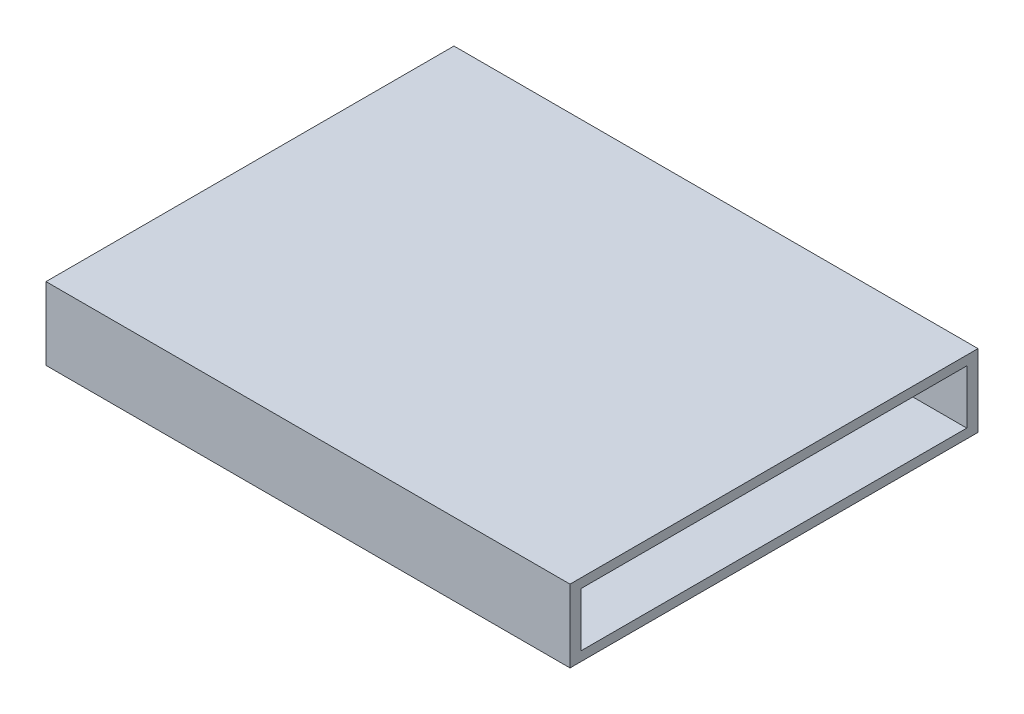
ISO-10303-21;
HEADER;
FILE_DESCRIPTION(('STEP AP214'),'2;1');
FILE_NAME('part.step','',(''),(''),'','','');
FILE_SCHEMA(('AUTOMOTIVE_DESIGN { 1 0 10303 214 1 1 1 1 }'));
ENDSEC;
DATA;
#1=APPLICATION_CONTEXT('core data for automotive mechanical design processes');
#2=APPLICATION_PROTOCOL_DEFINITION('international standard','automotive_design',2000,#1);
#3=PRODUCT_CONTEXT('',#1,'mechanical');
#4=PRODUCT('Part','Part','',(#3));
#5=PRODUCT_RELATED_PRODUCT_CATEGORY('part','',(#4));
#6=PRODUCT_DEFINITION_FORMATION('','',#4);
#7=PRODUCT_DEFINITION_CONTEXT('part definition',#1,'design');
#8=PRODUCT_DEFINITION('design','',#6,#7);
#9=PRODUCT_DEFINITION_SHAPE('','',#8);
#10=(LENGTH_UNIT() NAMED_UNIT(*) SI_UNIT(.MILLI.,.METRE.));
#11=(NAMED_UNIT(*) PLANE_ANGLE_UNIT() SI_UNIT($,.RADIAN.));
#12=(NAMED_UNIT(*) SI_UNIT($,.STERADIAN.) SOLID_ANGLE_UNIT());
#13=UNCERTAINTY_MEASURE_WITH_UNIT(LENGTH_MEASURE(1.E-05),#10,'distance_accuracy_value','');
#14=(GEOMETRIC_REPRESENTATION_CONTEXT(3) GLOBAL_UNCERTAINTY_ASSIGNED_CONTEXT((#13)) GLOBAL_UNIT_ASSIGNED_CONTEXT((#10,
#11,#12)) REPRESENTATION_CONTEXT('',''));
#15=CARTESIAN_POINT('',(0.,0.,0.));
#16=DIRECTION('',(0.,0.,1.));
#17=DIRECTION('',(1.,0.,0.));
#18=AXIS2_PLACEMENT_3D('',#15,#16,#17);
#19=CARTESIAN_POINT('',(0.,2.4638,0.));
#20=DIRECTION('',(1.,0.,0.));
#21=DIRECTION('',(0.,0.,-1.));
#22=AXIS2_PLACEMENT_3D('',#19,#20,#21);
#23=PLANE('',#22);
#24=DIRECTION('',(0.,0.,1.));
#25=VECTOR('',#24,1.);
#26=CARTESIAN_POINT('',(0.,0.,0.));
#27=LINE('',#26,#25);
#28=CARTESIAN_POINT('',(0.,0.,-13.843));
#29=VERTEX_POINT('',#28);
#30=CARTESIAN_POINT('',(0.,0.,0.));
#31=VERTEX_POINT('',#30);
#32=EDGE_CURVE('E163',#29,#31,#27,.T.);
#33=ORIENTED_EDGE('',*,*,#32,.T.);
#34=DIRECTION('',(0.,-1.,0.));
#35=VECTOR('',#34,1.);
#36=CARTESIAN_POINT('',(0.,2.4638,0.));
#37=LINE('',#36,#35);
#38=CARTESIAN_POINT('',(0.,2.4638,0.));
#39=VERTEX_POINT('',#38);
#40=EDGE_CURVE('E11',#39,#31,#37,.T.);
#41=ORIENTED_EDGE('',*,*,#40,.F.);
#42=DIRECTION('',(0.,0.,1.));
#43=VECTOR('',#42,1.);
#44=CARTESIAN_POINT('',(0.,2.4638,0.));
#45=LINE('',#44,#43);
#46=CARTESIAN_POINT('',(0.,2.4638,-13.843));
#47=VERTEX_POINT('',#46);
#48=EDGE_CURVE('E168',#47,#39,#45,.T.);
#49=ORIENTED_EDGE('',*,*,#48,.F.);
#50=DIRECTION('',(0.,-1.,0.));
#51=VECTOR('',#50,1.);
#52=CARTESIAN_POINT('',(0.,2.4638,-13.843));
#53=LINE('',#52,#51);
#54=EDGE_CURVE('E177',#47,#29,#53,.T.);
#55=ORIENTED_EDGE('',*,*,#54,.T.);
#56=EDGE_LOOP('',(#33,#41,#49,#55));
#57=FACE_BOUND('',#56,.T.);
#58=ADVANCED_FACE('F44',(#57),#23,.F.);
#59=CARTESIAN_POINT('',(0.,2.4638,0.));
#60=DIRECTION('',(0.,0.,-1.));
#61=DIRECTION('',(-1.,0.,0.));
#62=AXIS2_PLACEMENT_3D('',#59,#60,#61);
#63=PLANE('',#62);
#64=DIRECTION('',(1.,0.,0.));
#65=VECTOR('',#64,1.);
#66=CARTESIAN_POINT('',(0.,0.,0.));
#67=LINE('',#66,#65);
#68=CARTESIAN_POINT('',(17.78,0.,0.));
#69=VERTEX_POINT('',#68);
#70=EDGE_CURVE('E184',#31,#69,#67,.T.);
#71=ORIENTED_EDGE('',*,*,#70,.T.);
#72=DIRECTION('',(0.,-1.,0.));
#73=VECTOR('',#72,1.);
#74=CARTESIAN_POINT('',(17.78,2.4638,0.));
#75=LINE('',#74,#73);
#76=CARTESIAN_POINT('',(17.78,2.4638,0.));
#77=VERTEX_POINT('',#76);
#78=EDGE_CURVE('E52',#77,#69,#75,.T.);
#79=ORIENTED_EDGE('',*,*,#78,.F.);
#80=DIRECTION('',(1.,0.,0.));
#81=VECTOR('',#80,1.);
#82=CARTESIAN_POINT('',(0.,2.4638,0.));
#83=LINE('',#82,#81);
#84=EDGE_CURVE('E100',#39,#77,#83,.T.);
#85=ORIENTED_EDGE('',*,*,#84,.F.);
#86=ORIENTED_EDGE('',*,*,#40,.T.);
#87=EDGE_LOOP('',(#71,#79,#85,#86));
#88=FACE_BOUND('',#87,.T.);
#89=ADVANCED_FACE('F218',(#88),#63,.F.);
#90=CARTESIAN_POINT('',(17.78,2.4638,0.));
#91=DIRECTION('',(-1.,0.,0.));
#92=DIRECTION('',(0.,0.,1.));
#93=AXIS2_PLACEMENT_3D('',#90,#91,#92);
#94=PLANE('',#93);
#95=DIRECTION('',(0.,0.,-1.));
#96=VECTOR('',#95,1.);
#97=CARTESIAN_POINT('',(17.78,0.3175,-0.381000000000001));
#98=LINE('',#97,#96);
#99=CARTESIAN_POINT('',(17.78,0.3175,-0.380999999999992));
#100=VERTEX_POINT('',#99);
#101=CARTESIAN_POINT('',(17.78,0.317500000000002,-13.462));
#102=VERTEX_POINT('',#101);
#103=EDGE_CURVE('E154',#100,#102,#98,.T.);
#104=ORIENTED_EDGE('',*,*,#103,.F.);
#105=DIRECTION('',(0.,-1.,0.));
#106=VECTOR('',#105,1.);
#107=CARTESIAN_POINT('',(17.78,0.3175,-0.381000000000001));
#108=LINE('',#107,#106);
#109=CARTESIAN_POINT('',(17.78,2.1463,-0.381000000000001));
#110=VERTEX_POINT('',#109);
#111=EDGE_CURVE('E58',#110,#100,#108,.T.);
#112=ORIENTED_EDGE('',*,*,#111,.F.);
#113=DIRECTION('',(0.,0.,1.));
#114=VECTOR('',#113,1.);
#115=CARTESIAN_POINT('',(17.78,2.1463,-0.381000000000001));
#116=LINE('',#115,#114);
#117=CARTESIAN_POINT('',(17.78,2.1463,-13.462));
#118=VERTEX_POINT('',#117);
#119=EDGE_CURVE('E142',#118,#110,#116,.T.);
#120=ORIENTED_EDGE('',*,*,#119,.F.);
#121=DIRECTION('',(0.,1.,0.));
#122=VECTOR('',#121,1.);
#123=CARTESIAN_POINT('',(17.78,0.317500000000002,-13.462));
#124=LINE('',#123,#122);
#125=EDGE_CURVE('E148',#102,#118,#124,.T.);
#126=ORIENTED_EDGE('',*,*,#125,.F.);
#127=EDGE_LOOP('',(#104,#112,#120,#126));
#128=FACE_BOUND('',#127,.T.);
#129=DIRECTION('',(0.,0.,-1.));
#130=VECTOR('',#129,1.);
#131=CARTESIAN_POINT('',(17.78,0.,0.));
#132=LINE('',#131,#130);
#133=CARTESIAN_POINT('',(17.78,0.,-13.843));
#134=VERTEX_POINT('',#133);
#135=EDGE_CURVE('E186',#69,#134,#132,.T.);
#136=ORIENTED_EDGE('',*,*,#135,.T.);
#137=DIRECTION('',(0.,-1.,0.));
#138=VECTOR('',#137,1.);
#139=CARTESIAN_POINT('',(17.78,2.4638,-13.843));
#140=LINE('',#139,#138);
#141=CARTESIAN_POINT('',(17.78,2.4638,-13.843));
#142=VERTEX_POINT('',#141);
#143=EDGE_CURVE('E194',#142,#134,#140,.T.);
#144=ORIENTED_EDGE('',*,*,#143,.F.);
#145=DIRECTION('',(0.,0.,-1.));
#146=VECTOR('',#145,1.);
#147=CARTESIAN_POINT('',(17.78,2.4638,0.));
#148=LINE('',#147,#146);
#149=EDGE_CURVE('E172',#77,#142,#148,.T.);
#150=ORIENTED_EDGE('',*,*,#149,.F.);
#151=ORIENTED_EDGE('',*,*,#78,.T.);
#152=EDGE_LOOP('',(#136,#144,#150,#151));
#153=FACE_BOUND('',#152,.T.);
#154=ADVANCED_FACE('F203',(#128,#153),#94,.F.);
#155=CARTESIAN_POINT('',(0.,2.4638,-13.843));
#156=DIRECTION('',(0.,0.,1.));
#157=DIRECTION('',(1.,0.,0.));
#158=AXIS2_PLACEMENT_3D('',#155,#156,#157);
#159=PLANE('',#158);
#160=DIRECTION('',(-1.,0.,0.));
#161=VECTOR('',#160,1.);
#162=CARTESIAN_POINT('',(0.,0.,-13.843));
#163=LINE('',#162,#161);
#164=EDGE_CURVE('E89',#134,#29,#163,.T.);
#165=ORIENTED_EDGE('',*,*,#164,.T.);
#166=ORIENTED_EDGE('',*,*,#54,.F.);
#167=DIRECTION('',(-1.,0.,0.));
#168=VECTOR('',#167,1.);
#169=CARTESIAN_POINT('',(0.,2.4638,-13.843));
#170=LINE('',#169,#168);
#171=EDGE_CURVE('E69',#142,#47,#170,.T.);
#172=ORIENTED_EDGE('',*,*,#171,.F.);
#173=ORIENTED_EDGE('',*,*,#143,.T.);
#174=EDGE_LOOP('',(#165,#166,#172,#173));
#175=FACE_BOUND('',#174,.T.);
#176=ADVANCED_FACE('F207',(#175),#159,.F.);
#177=CARTESIAN_POINT('',(0.,2.4638,0.));
#178=DIRECTION('',(0.,-1.,0.));
#179=DIRECTION('',(0.,0.,-1.));
#180=AXIS2_PLACEMENT_3D('',#177,#178,#179);
#181=PLANE('',#180);
#182=ORIENTED_EDGE('',*,*,#48,.T.);
#183=ORIENTED_EDGE('',*,*,#84,.T.);
#184=ORIENTED_EDGE('',*,*,#149,.T.);
#185=ORIENTED_EDGE('',*,*,#171,.T.);
#186=EDGE_LOOP('',(#182,#183,#184,#185));
#187=FACE_BOUND('',#186,.T.);
#188=ADVANCED_FACE('F211',(#187),#181,.F.);
#189=CARTESIAN_POINT('',(0.,0.,0.));
#190=DIRECTION('',(0.,-1.,0.));
#191=DIRECTION('',(0.,0.,-1.));
#192=AXIS2_PLACEMENT_3D('',#189,#190,#191);
#193=PLANE('',#192);
#194=ORIENTED_EDGE('',*,*,#32,.F.);
#195=ORIENTED_EDGE('',*,*,#164,.F.);
#196=ORIENTED_EDGE('',*,*,#135,.F.);
#197=ORIENTED_EDGE('',*,*,#70,.F.);
#198=EDGE_LOOP('',(#194,#195,#196,#197));
#199=FACE_BOUND('',#198,.T.);
#200=ADVANCED_FACE('F202',(#199),#193,.T.);
#201=CARTESIAN_POINT('',(0.406399999999998,0.3175,-0.380999999999992));
#202=DIRECTION('',(0.,0.,1.));
#203=DIRECTION('',(1.,0.,0.));
#204=AXIS2_PLACEMENT_3D('',#201,#202,#203);
#205=PLANE('',#204);
#206=ORIENTED_EDGE('',*,*,#111,.T.);
#207=DIRECTION('',(1.,0.,0.));
#208=VECTOR('',#207,1.);
#209=CARTESIAN_POINT('',(0.406399999999998,0.3175,-0.380999999999992));
#210=LINE('',#209,#208);
#211=CARTESIAN_POINT('',(0.406399999999998,0.3175,-0.380999999999992));
#212=VERTEX_POINT('',#211);
#213=EDGE_CURVE('E116',#212,#100,#210,.T.);
#214=ORIENTED_EDGE('',*,*,#213,.F.);
#215=DIRECTION('',(0.,-1.,0.));
#216=VECTOR('',#215,1.);
#217=CARTESIAN_POINT('',(0.406399999999998,0.3175,-0.380999999999992));
#218=LINE('',#217,#216);
#219=CARTESIAN_POINT('',(0.406399999999998,2.1463,-0.380999999999992));
#220=VERTEX_POINT('',#219);
#221=EDGE_CURVE('E123',#220,#212,#218,.T.);
#222=ORIENTED_EDGE('',*,*,#221,.F.);
#223=DIRECTION('',(1.,0.,0.));
#224=VECTOR('',#223,1.);
#225=CARTESIAN_POINT('',(0.406399999999998,2.1463,-0.380999999999992));
#226=LINE('',#225,#224);
#227=EDGE_CURVE('E161',#220,#110,#226,.T.);
#228=ORIENTED_EDGE('',*,*,#227,.T.);
#229=EDGE_LOOP('',(#206,#214,#222,#228));
#230=FACE_BOUND('',#229,.T.);
#231=ADVANCED_FACE('F118',(#230),#205,.F.);
#232=CARTESIAN_POINT('',(0.406399999999998,2.1463,-0.380999999999992));
#233=DIRECTION('',(0.,1.,0.));
#234=DIRECTION('',(0.,0.,1.));
#235=AXIS2_PLACEMENT_3D('',#232,#233,#234);
#236=PLANE('',#235);
#237=ORIENTED_EDGE('',*,*,#119,.T.);
#238=ORIENTED_EDGE('',*,*,#227,.F.);
#239=DIRECTION('',(0.,0.,1.));
#240=VECTOR('',#239,1.);
#241=CARTESIAN_POINT('',(0.406399999999998,2.1463,-0.380999999999992));
#242=LINE('',#241,#240);
#243=CARTESIAN_POINT('',(0.406399999999991,2.1463,-13.462));
#244=VERTEX_POINT('',#243);
#245=EDGE_CURVE('E126',#244,#220,#242,.T.);
#246=ORIENTED_EDGE('',*,*,#245,.F.);
#247=DIRECTION('',(1.,0.,0.));
#248=VECTOR('',#247,1.);
#249=CARTESIAN_POINT('',(0.406399999999991,2.1463,-13.462));
#250=LINE('',#249,#248);
#251=EDGE_CURVE('E164',#244,#118,#250,.T.);
#252=ORIENTED_EDGE('',*,*,#251,.T.);
#253=EDGE_LOOP('',(#237,#238,#246,#252));
#254=FACE_BOUND('',#253,.T.);
#255=ADVANCED_FACE('F262',(#254),#236,.F.);
#256=CARTESIAN_POINT('',(0.406399999999991,0.317500000000002,-13.462));
#257=DIRECTION('',(0.,0.,-1.));
#258=DIRECTION('',(0.,1.,0.));
#259=AXIS2_PLACEMENT_3D('',#256,#257,#258);
#260=PLANE('',#259);
#261=ORIENTED_EDGE('',*,*,#125,.T.);
#262=ORIENTED_EDGE('',*,*,#251,.F.);
#263=DIRECTION('',(0.,1.,0.));
#264=VECTOR('',#263,1.);
#265=CARTESIAN_POINT('',(0.406399999999991,0.317500000000002,-13.462));
#266=LINE('',#265,#264);
#267=CARTESIAN_POINT('',(0.406399999999991,0.317500000000002,-13.462));
#268=VERTEX_POINT('',#267);
#269=EDGE_CURVE('E140',#268,#244,#266,.T.);
#270=ORIENTED_EDGE('',*,*,#269,.F.);
#271=DIRECTION('',(1.,0.,0.));
#272=VECTOR('',#271,1.);
#273=CARTESIAN_POINT('',(0.406399999999991,0.317500000000002,-13.462));
#274=LINE('',#273,#272);
#275=EDGE_CURVE('E130',#268,#102,#274,.T.);
#276=ORIENTED_EDGE('',*,*,#275,.T.);
#277=EDGE_LOOP('',(#261,#262,#270,#276));
#278=FACE_BOUND('',#277,.T.);
#279=ADVANCED_FACE('F272',(#278),#260,.F.);
#280=CARTESIAN_POINT('',(0.406399999999998,0.3175,-0.380999999999992));
#281=DIRECTION('',(0.,-1.,0.));
#282=DIRECTION('',(0.,0.,-1.));
#283=AXIS2_PLACEMENT_3D('',#280,#281,#282);
#284=PLANE('',#283);
#285=ORIENTED_EDGE('',*,*,#103,.T.);
#286=ORIENTED_EDGE('',*,*,#275,.F.);
#287=DIRECTION('',(0.,0.,-1.));
#288=VECTOR('',#287,1.);
#289=CARTESIAN_POINT('',(0.406399999999998,0.3175,-0.380999999999992));
#290=LINE('',#289,#288);
#291=EDGE_CURVE('E134',#212,#268,#290,.T.);
#292=ORIENTED_EDGE('',*,*,#291,.F.);
#293=ORIENTED_EDGE('',*,*,#213,.T.);
#294=EDGE_LOOP('',(#285,#286,#292,#293));
#295=FACE_BOUND('',#294,.T.);
#296=ADVANCED_FACE('F131',(#295),#284,.F.);
#297=CARTESIAN_POINT('',(0.406399999999998,0.,0.));
#298=DIRECTION('',(-1.,0.,0.));
#299=DIRECTION('',(0.,0.,1.));
#300=AXIS2_PLACEMENT_3D('',#297,#298,#299);
#301=PLANE('',#300);
#302=ORIENTED_EDGE('',*,*,#221,.T.);
#303=ORIENTED_EDGE('',*,*,#291,.T.);
#304=ORIENTED_EDGE('',*,*,#269,.T.);
#305=ORIENTED_EDGE('',*,*,#245,.T.);
#306=EDGE_LOOP('',(#302,#303,#304,#305));
#307=FACE_BOUND('',#306,.T.);
#308=ADVANCED_FACE('F139',(#307),#301,.F.);
#309=CLOSED_SHELL('',(#58,#89,#154,#176,#188,#200,#231,#255,#279,#296,#308));
#310=MANIFOLD_SOLID_BREP('B2',#309);
#311=ADVANCED_BREP_SHAPE_REPRESENTATION('',(#18,#310),#14);
#312=SHAPE_DEFINITION_REPRESENTATION(#9,#311);
ENDSEC;
END-ISO-10303-21;
